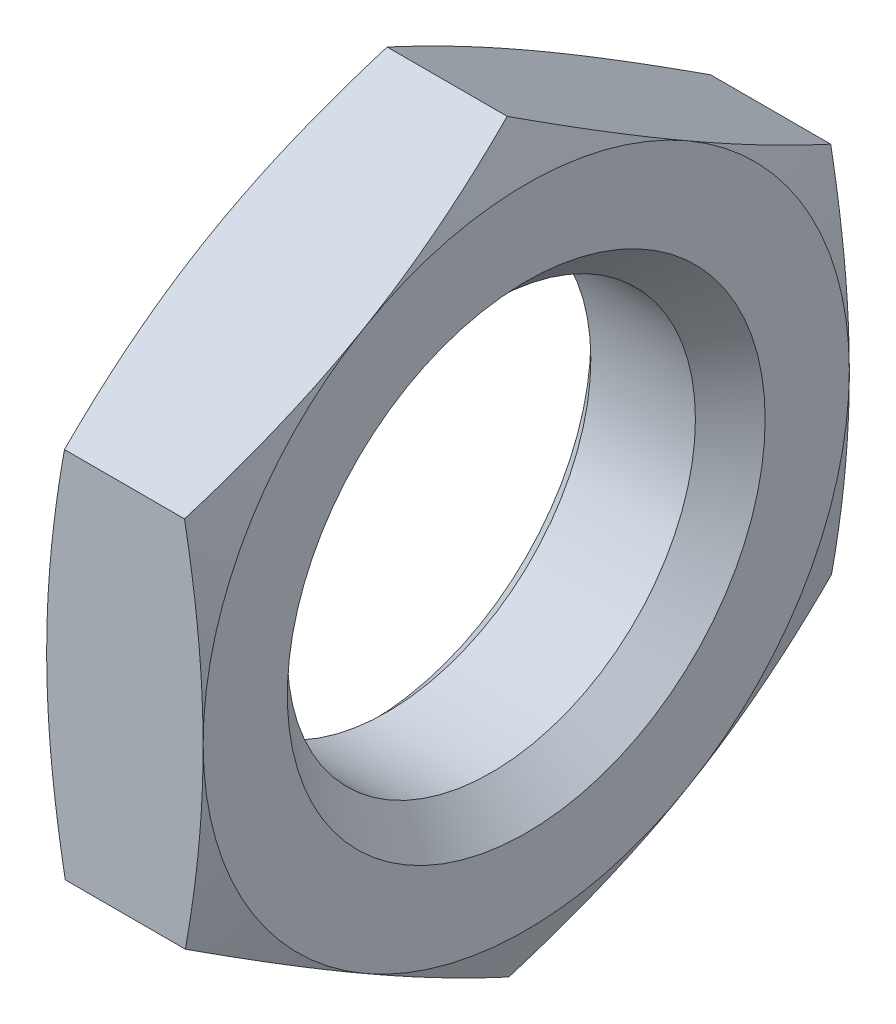
ISO-10303-21;
HEADER;
FILE_DESCRIPTION(('STEP AP214'),'2;1');
FILE_NAME('part.step','',(''),(''),'','','');
FILE_SCHEMA(('AUTOMOTIVE_DESIGN { 1 0 10303 214 1 1 1 1 }'));
ENDSEC;
DATA;
#1=APPLICATION_CONTEXT('core data for automotive mechanical design processes');
#2=APPLICATION_PROTOCOL_DEFINITION('international standard','automotive_design',2000,#1);
#3=PRODUCT_CONTEXT('',#1,'mechanical');
#4=PRODUCT('Part','Part','',(#3));
#5=PRODUCT_RELATED_PRODUCT_CATEGORY('part','',(#4));
#6=PRODUCT_DEFINITION_FORMATION('','',#4);
#7=PRODUCT_DEFINITION_CONTEXT('part definition',#1,'design');
#8=PRODUCT_DEFINITION('design','',#6,#7);
#9=PRODUCT_DEFINITION_SHAPE('','',#8);
#10=(LENGTH_UNIT() NAMED_UNIT(*) SI_UNIT(.MILLI.,.METRE.));
#11=(NAMED_UNIT(*) PLANE_ANGLE_UNIT() SI_UNIT($,.RADIAN.));
#12=(NAMED_UNIT(*) SI_UNIT($,.STERADIAN.) SOLID_ANGLE_UNIT());
#13=UNCERTAINTY_MEASURE_WITH_UNIT(LENGTH_MEASURE(1.E-05),#10,'distance_accuracy_value','');
#14=(GEOMETRIC_REPRESENTATION_CONTEXT(3) GLOBAL_UNCERTAINTY_ASSIGNED_CONTEXT((#13)) GLOBAL_UNIT_ASSIGNED_CONTEXT((#10,
#11,#12)) REPRESENTATION_CONTEXT('',''));
#15=CARTESIAN_POINT('',(0.,0.,0.));
#16=DIRECTION('',(0.,0.,1.));
#17=DIRECTION('',(1.,0.,0.));
#18=AXIS2_PLACEMENT_3D('',#15,#16,#17);
#19=CARTESIAN_POINT('',(4.59999999999999,-5.46387461975121,-9.51206641445337));
#20=DIRECTION('',(0.,-0.00220416988287132,0.999997570814613));
#21=DIRECTION('',(0.,-0.999997570814613,-0.00220416988287132));
#22=AXIS2_PLACEMENT_3D('',#19,#20,#21);
#23=PLANE('',#22);
#24=CARTESIAN_POINT('',(4.06505288603794,-5.46407461975121,-9.51206685528842));
#25=CARTESIAN_POINT('',(4.14775708448037,-5.00978168241182,-9.51106551404549));
#26=CARTESIAN_POINT('',(4.22299075546714,-4.55399071947763,-9.51006087089164));
#27=CARTESIAN_POINT('',(4.35535262343732,-3.63944530321819,-9.50804505253181));
#28=CARTESIAN_POINT('',(4.41246665386016,-3.18068881585676,-9.50703387284245));
#29=CARTESIAN_POINT('',(4.50484691282821,-2.26530330051834,-9.50501620275703));
#30=CARTESIAN_POINT('',(4.54031462955601,-1.80869517614271,-9.50400975843617));
#31=CARTESIAN_POINT('',(4.58788679321137,-0.894411186660822,-9.50199451630677));
#32=CARTESIAN_POINT('',(4.59999999999999,-0.436735786386771,-9.5009857195228));
#33=CARTESIAN_POINT('',(4.59999999999999,0.478615014161329,-9.49896812595486));
#34=CARTESIAN_POINT('',(4.58788679321137,0.936290414435379,-9.49795932917089));
#35=CARTESIAN_POINT('',(4.54031462955601,1.85057440391726,-9.49594408704148));
#36=CARTESIAN_POINT('',(4.50484691282821,2.30718252829289,-9.49493764272062));
#37=CARTESIAN_POINT('',(4.41246665386016,3.22256804363132,-9.4929199726352));
#38=CARTESIAN_POINT('',(4.35535262343732,3.68132453099275,-9.49190879294584));
#39=CARTESIAN_POINT('',(4.22299075546714,4.59586994725219,-9.48989297458601));
#40=CARTESIAN_POINT('',(4.14775708448037,5.05166091018637,-9.48888833143216));
#41=CARTESIAN_POINT('',(4.06505288603794,5.50595384752577,-9.48788699018923));
#42=B_SPLINE_CURVE_WITH_KNOTS('',3,(#24,#25,#26,#27,#28,#29,#30,#31,#32,#33,#34,#35,#36,#37,#38,
#39,#40,#41),.UNSPECIFIED.,.F.,.F.,(4,2,2,2,2,2,2,2,4),(0.,1.38542535879321,2.77193123674513,
4.14532616339404,5.51820585375358,6.89108554411312,8.26448047076202,9.65098634871394,
11.0364117075072),.UNSPECIFIED.);
#43=CARTESIAN_POINT('',(4.06508928364747,-5.46387461975121,-9.51206641445337));
#44=VERTEX_POINT('',#43);
#45=CARTESIAN_POINT('',(4.59999999999999,0.0209396138872772,-9.49997692273882));
#46=VERTEX_POINT('',#45);
#47=EDGE_CURVE('E371',#44,#46,#42,.T.);
#48=ORIENTED_EDGE('',*,*,#47,.F.);
#49=DIRECTION('',(-1.,0.,0.));
#50=VECTOR('',#49,1.);
#51=CARTESIAN_POINT('',(4.59999999999999,-5.46387461975121,-9.51206641445337));
#52=LINE('',#51,#50);
#53=CARTESIAN_POINT('',(0.534910716352532,-5.46387461975121,-9.51206641445337));
#54=VERTEX_POINT('',#53);
#55=EDGE_CURVE('E270',#44,#54,#52,.T.);
#56=ORIENTED_EDGE('',*,*,#55,.T.);
#57=CARTESIAN_POINT('',(0.53494711396207,5.50595384752577,-9.48788699018923));
#58=CARTESIAN_POINT('',(0.452242915519633,5.05166091018637,-9.48888833143216));
#59=CARTESIAN_POINT('',(0.377009244532853,4.59586994725219,-9.48989297458601));
#60=CARTESIAN_POINT('',(0.244647376562674,3.68132453099275,-9.49190879294584));
#61=CARTESIAN_POINT('',(0.187533346139829,3.22256804363132,-9.4929199726352));
#62=CARTESIAN_POINT('',(0.0951530871717847,2.30718252829289,-9.49493764272062));
#63=CARTESIAN_POINT('',(0.0596853704439779,1.85057440391726,-9.49594408704148));
#64=CARTESIAN_POINT('',(0.0121132067886231,0.936290414435379,-9.49795932917089));
#65=CARTESIAN_POINT('',(0.,0.478615014161329,-9.49896812595486));
#66=CARTESIAN_POINT('',(0.,-0.436735786386771,-9.5009857195228));
#67=CARTESIAN_POINT('',(0.0121132067886229,-0.894411186660821,-9.50199451630677));
#68=CARTESIAN_POINT('',(0.0596853704439779,-1.80869517614271,-9.50400975843617));
#69=CARTESIAN_POINT('',(0.0951530871717849,-2.26530330051833,-9.50501620275703));
#70=CARTESIAN_POINT('',(0.187533346139829,-3.18068881585676,-9.50703387284245));
#71=CARTESIAN_POINT('',(0.244647376562674,-3.6394453032182,-9.50804505253181));
#72=CARTESIAN_POINT('',(0.377009244532853,-4.55399071947763,-9.51006087089164));
#73=CARTESIAN_POINT('',(0.452242915519632,-5.00978168241182,-9.51106551404549));
#74=CARTESIAN_POINT('',(0.53494711396207,-5.46407461975121,-9.51206685528842));
#75=B_SPLINE_CURVE_WITH_KNOTS('',3,(#57,#58,#59,#60,#61,#62,#63,#64,#65,#66,#67,#68,#69,#70,#71,
#72,#73,#74),.UNSPECIFIED.,.F.,.F.,(4,2,2,2,2,2,2,2,4),(0.,1.38542535879322,2.77193123674514,
4.14532616339404,5.51820585375358,6.89108554411312,8.26448047076202,9.65098634871394,
11.0364117075072),.UNSPECIFIED.);
#76=CARTESIAN_POINT('',(0.,0.0209396138872772,-9.49997692273882));
#77=VERTEX_POINT('',#76);
#78=EDGE_CURVE('E243',#77,#54,#75,.T.);
#79=ORIENTED_EDGE('',*,*,#78,.F.);
#80=CARTESIAN_POINT('',(0.534910716352532,5.50575384752577,-9.48788743102428));
#81=VERTEX_POINT('',#80);
#82=EDGE_CURVE('E324',#81,#77,#75,.T.);
#83=ORIENTED_EDGE('',*,*,#82,.F.);
#84=DIRECTION('',(-1.,0.,0.));
#85=VECTOR('',#84,1.);
#86=CARTESIAN_POINT('',(4.59999999999999,5.50575384752577,-9.48788743102428));
#87=LINE('',#86,#85);
#88=CARTESIAN_POINT('',(4.06508928364747,5.50575384752577,-9.48788743102428));
#89=VERTEX_POINT('',#88);
#90=EDGE_CURVE('E279',#89,#81,#87,.T.);
#91=ORIENTED_EDGE('',*,*,#90,.F.);
#92=EDGE_CURVE('E146',#46,#89,#42,.T.);
#93=ORIENTED_EDGE('',*,*,#92,.F.);
#94=EDGE_LOOP('',(#48,#56,#79,#83,#91,#93));
#95=FACE_BOUND('',#94,.T.);
#96=ADVANCED_FACE('F52',(#95),#23,.F.);
#97=CARTESIAN_POINT('',(4.59999999999999,5.50575384752577,-9.48788743102428));
#98=DIRECTION('',(0.,-0.867125384989619,0.498089918294484));
#99=DIRECTION('',(0.,-0.498089918294484,-0.867125384989619));
#100=AXIS2_PLACEMENT_3D('',#97,#98,#99);
#101=PLANE('',#100);
#102=CARTESIAN_POINT('',(4.06504730863669,5.50563896450495,-9.48808743102428));
#103=CARTESIAN_POINT('',(4.14775231079011,5.73191950073375,-9.09415535192314));
#104=CARTESIAN_POINT('',(4.22298673902135,5.95894619869942,-8.69892427888622));
#105=CARTESIAN_POINT('',(4.3553499712917,6.41447570420105,-7.90589237174632));
#106=CARTESIAN_POINT('',(4.41246460837906,6.64297952490508,-7.50808977381775));
#107=CARTESIAN_POINT('',(4.50484586014554,7.09892748141666,-6.71432938477171));
#108=CARTESIAN_POINT('',(4.5403139669336,7.32636120506701,-6.31838972019225));
#109=CARTESIAN_POINT('',(4.58788665679706,7.7817604926368,-5.52558450961883));
#110=CARTESIAN_POINT('',(4.59999999999999,8.00972582501909,-5.12871936670821));
#111=CARTESIAN_POINT('',(4.59999999999999,8.46565648978367,-4.33498908088698));
#112=CARTESIAN_POINT('',(4.58788665679706,8.69362182216596,-3.93812393797636));
#113=CARTESIAN_POINT('',(4.5403139669336,9.14902110973575,-3.14531872740294));
#114=CARTESIAN_POINT('',(4.50484586014554,9.37645483338609,-2.74937906282348));
#115=CARTESIAN_POINT('',(4.41246460837906,9.83240278989768,-1.95561867377744));
#116=CARTESIAN_POINT('',(4.3553499712917,10.0609066106017,-1.55781607584887));
#117=CARTESIAN_POINT('',(4.22298673902135,10.5164361161033,-0.764784168708969));
#118=CARTESIAN_POINT('',(4.1477523107901,10.743462814069,-0.369553095672043));
#119=CARTESIAN_POINT('',(4.06504730863669,10.9697433502978,0.0243789834290936));
#120=B_SPLINE_CURVE_WITH_KNOTS('',3,(#102,#103,#104,#105,#106,#107,#108,#109,#110,#111,#112,
#113,#114,#115,#116,#117,#118,#119),.UNSPECIFIED.,.F.,.F.,(4,2,2,2,2,2,2,2,4),(0.,
1.3854332282636,2.77194700262361,4.14534962448271,5.51823699708701,6.8911243696913,
8.2645269915504,9.65104076591042,11.036473994174),.UNSPECIFIED.);
#121=CARTESIAN_POINT('',(4.59999999999999,8.23769115740138,-4.73185422379759));
#122=VERTEX_POINT('',#121);
#123=EDGE_CURVE('E142',#89,#122,#120,.T.);
#124=ORIENTED_EDGE('',*,*,#123,.F.);
#125=ORIENTED_EDGE('',*,*,#90,.T.);
#126=CARTESIAN_POINT('',(0.534952691363305,10.9697433502978,0.0243789834290936));
#127=CARTESIAN_POINT('',(0.452247689209888,10.743462814069,-0.369553095672043));
#128=CARTESIAN_POINT('',(0.377013260978639,10.5164361161033,-0.764784168708969));
#129=CARTESIAN_POINT('',(0.244650028708293,10.0609066106017,-1.55781607584887));
#130=CARTESIAN_POINT('',(0.187535391620937,9.83240278989768,-1.95561867377744));
#131=CARTESIAN_POINT('',(0.0951541398544488,9.37645483338609,-2.74937906282348));
#132=CARTESIAN_POINT('',(0.0596860330663905,9.14902110973575,-3.14531872740294));
#133=CARTESIAN_POINT('',(0.0121133432029318,8.69362182216596,-3.93812393797636));
#134=CARTESIAN_POINT('',(0.,8.46565648978367,-4.33498908088698));
#135=CARTESIAN_POINT('',(0.,8.00972582501909,-5.12871936670821));
#136=CARTESIAN_POINT('',(0.0121133432029316,7.7817604926368,-5.52558450961883));
#137=CARTESIAN_POINT('',(0.0596860330663904,7.32636120506701,-6.31838972019225));
#138=CARTESIAN_POINT('',(0.0951541398544488,7.09892748141666,-6.71432938477171));
#139=CARTESIAN_POINT('',(0.187535391620936,6.64297952490508,-7.50808977381775));
#140=CARTESIAN_POINT('',(0.244650028708292,6.41447570420105,-7.90589237174632));
#141=CARTESIAN_POINT('',(0.377013260978638,5.95894619869942,-8.69892427888622));
#142=CARTESIAN_POINT('',(0.452247689209887,5.73191950073375,-9.09415535192314));
#143=CARTESIAN_POINT('',(0.534952691363305,5.50563896450495,-9.48808743102428));
#144=B_SPLINE_CURVE_WITH_KNOTS('',3,(#126,#127,#128,#129,#130,#131,#132,#133,#134,#135,#136,
#137,#138,#139,#140,#141,#142,#143),.UNSPECIFIED.,.F.,.F.,(4,2,2,2,2,2,2,2,4),(0.,
1.38543322826359,2.77194700262361,4.14534962448271,5.518236997087,6.8911243696913,
8.2645269915504,9.65104076591041,11.036473994174),.UNSPECIFIED.);
#145=CARTESIAN_POINT('',(0.,8.23769115740138,-4.73185422379759));
#146=VERTEX_POINT('',#145);
#147=EDGE_CURVE('E240',#146,#81,#144,.T.);
#148=ORIENTED_EDGE('',*,*,#147,.F.);
#149=CARTESIAN_POINT('',(0.534910716352532,10.969628467277,0.0241789834290879));
#150=VERTEX_POINT('',#149);
#151=EDGE_CURVE('E255',#150,#146,#144,.T.);
#152=ORIENTED_EDGE('',*,*,#151,.F.);
#153=DIRECTION('',(-1.,0.,0.));
#154=VECTOR('',#153,1.);
#155=CARTESIAN_POINT('',(4.59999999999999,10.969628467277,0.0241789834290879));
#156=LINE('',#155,#154);
#157=CARTESIAN_POINT('',(4.06508928364747,10.969628467277,0.0241789834290879));
#158=VERTEX_POINT('',#157);
#159=EDGE_CURVE('E165',#158,#150,#156,.T.);
#160=ORIENTED_EDGE('',*,*,#159,.F.);
#161=EDGE_CURVE('E150',#122,#158,#120,.T.);
#162=ORIENTED_EDGE('',*,*,#161,.F.);
#163=EDGE_LOOP('',(#124,#125,#148,#152,#160,#162));
#164=FACE_BOUND('',#163,.T.);
#165=ADVANCED_FACE('F163',(#164),#101,.F.);
#166=CARTESIAN_POINT('',(4.59999999999999,10.969628467277,0.0241789834290879));
#167=DIRECTION('',(0.,-0.864921215106748,-0.50190765252013));
#168=DIRECTION('',(0.,0.50190765252013,-0.864921215106748));
#169=AXIS2_PLACEMENT_3D('',#166,#167,#168);
#170=PLANE('',#169);
#171=CARTESIAN_POINT('',(4.06504720166566,10.9697445258598,0.023978983429096));
#172=CARTESIAN_POINT('',(4.14775221923373,10.7417295818619,0.416909757516641));
#173=CARTESIAN_POINT('',(4.22298666198845,10.5129627568208,0.811136223873899));
#174=CARTESIAN_POINT('',(4.35534992042521,10.0539416827472,1.6021523862174));
#175=CARTESIAN_POINT('',(4.41246456914801,9.8236864127804,1.9989438415468));
#176=CARTESIAN_POINT('',(4.50484583995575,9.36424368027611,2.79068663421848));
#177=CARTESIAN_POINT('',(4.54031395422492,9.13506670970743,3.18561989109046));
#178=CARTESIAN_POINT('',(4.58788665418072,8.67617685172253,3.97640993299472));
#179=CARTESIAN_POINT('',(4.59999999999999,8.44646419761831,4.37226631596798));
#180=CARTESIAN_POINT('',(4.59999999999999,7.98703888940988,5.16397908191448));
#181=CARTESIAN_POINT('',(4.58788665418072,7.75732623530566,5.55983546488774));
#182=CARTESIAN_POINT('',(4.54031395422492,7.29843637732077,6.35062550679199));
#183=CARTESIAN_POINT('',(4.50484583995575,7.06925940675208,6.74555876366398));
#184=CARTESIAN_POINT('',(4.41246456914801,6.60981667424779,7.53730155633566));
#185=CARTESIAN_POINT('',(4.35534992042521,6.37956140428098,7.93409301166506));
#186=CARTESIAN_POINT('',(4.22298666198845,5.92054033020742,8.72510917400856));
#187=CARTESIAN_POINT('',(4.14775221923373,5.6917735051663,9.11933564036582));
#188=CARTESIAN_POINT('',(4.06504720166566,5.46375856116836,9.51226641445337));
#189=B_SPLINE_CURVE_WITH_KNOTS('',3,(#171,#172,#173,#174,#175,#176,#177,#178,#179,#180,#181,
#182,#183,#184,#185,#186,#187,#188),.UNSPECIFIED.,.F.,.F.,(4,2,2,2,2,2,2,2,4),(0.,
1.38543337919476,2.77194730500259,4.14535007445066,5.51823759439524,6.89112511433982,
8.26452788378788,9.65104180959572,11.0364751887905),.UNSPECIFIED.);
#190=CARTESIAN_POINT('',(4.59999999999999,8.2167515435141,4.76812269894124));
#191=VERTEX_POINT('',#190);
#192=EDGE_CURVE('E155',#158,#191,#189,.T.);
#193=ORIENTED_EDGE('',*,*,#192,.F.);
#194=ORIENTED_EDGE('',*,*,#159,.T.);
#195=CARTESIAN_POINT('',(0.534952798334348,5.46375856116836,9.51226641445337));
#196=CARTESIAN_POINT('',(0.452247780766266,5.6917735051663,9.11933564036582));
#197=CARTESIAN_POINT('',(0.377013338011548,5.92054033020742,8.72510917400856));
#198=CARTESIAN_POINT('',(0.244650079574786,6.37956140428098,7.93409301166506));
#199=CARTESIAN_POINT('',(0.187535430851987,6.60981667424779,7.53730155633566));
#200=CARTESIAN_POINT('',(0.095154160044247,7.06925940675208,6.74555876366398));
#201=CARTESIAN_POINT('',(0.0596860457750757,7.29843637732076,6.35062550679199));
#202=CARTESIAN_POINT('',(0.012113345819272,7.75732623530566,5.55983546488774));
#203=CARTESIAN_POINT('',(0.,7.98703888940988,5.16397908191448));
#204=CARTESIAN_POINT('',(0.,8.44646419761831,4.37226631596798));
#205=CARTESIAN_POINT('',(0.0121133458192715,8.67617685172253,3.97640993299472));
#206=CARTESIAN_POINT('',(0.0596860457750754,9.13506670970743,3.18561989109046));
#207=CARTESIAN_POINT('',(0.0951541600442474,9.36424368027611,2.79068663421848));
#208=CARTESIAN_POINT('',(0.187535430851987,9.8236864127804,1.9989438415468));
#209=CARTESIAN_POINT('',(0.244650079574786,10.0539416827472,1.6021523862174));
#210=CARTESIAN_POINT('',(0.377013338011547,10.5129627568208,0.811136223873898));
#211=CARTESIAN_POINT('',(0.452247780766265,10.7417295818619,0.41690975751664));
#212=CARTESIAN_POINT('',(0.534952798334348,10.9697445258598,0.023978983429096));
#213=B_SPLINE_CURVE_WITH_KNOTS('',3,(#195,#196,#197,#198,#199,#200,#201,#202,#203,#204,#205,
#206,#207,#208,#209,#210,#211,#212),.UNSPECIFIED.,.F.,.F.,(4,2,2,2,2,2,2,2,4),(0.,
1.38543337919476,2.7719473050026,4.14535007445066,5.51823759439524,6.89112511433983,
8.26452788378789,9.65104180959572,11.0364751887905),.UNSPECIFIED.);
#214=CARTESIAN_POINT('',(0.,8.2167515435141,4.76812269894124));
#215=VERTEX_POINT('',#214);
#216=EDGE_CURVE('E256',#215,#150,#213,.T.);
#217=ORIENTED_EDGE('',*,*,#216,.F.);
#218=CARTESIAN_POINT('',(0.534910716352532,5.46387461975121,9.51206641445337));
#219=VERTEX_POINT('',#218);
#220=EDGE_CURVE('E263',#219,#215,#213,.T.);
#221=ORIENTED_EDGE('',*,*,#220,.F.);
#222=DIRECTION('',(-1.,0.,0.));
#223=VECTOR('',#222,1.);
#224=CARTESIAN_POINT('',(4.59999999999999,5.46387461975121,9.51206641445337));
#225=LINE('',#224,#223);
#226=CARTESIAN_POINT('',(4.06508928364747,5.46387461975121,9.51206641445337));
#227=VERTEX_POINT('',#226);
#228=EDGE_CURVE('E276',#227,#219,#225,.T.);
#229=ORIENTED_EDGE('',*,*,#228,.F.);
#230=EDGE_CURVE('E166',#191,#227,#189,.T.);
#231=ORIENTED_EDGE('',*,*,#230,.F.);
#232=EDGE_LOOP('',(#193,#194,#217,#221,#229,#231));
#233=FACE_BOUND('',#232,.T.);
#234=ADVANCED_FACE('F227',(#233),#170,.F.);
#235=CARTESIAN_POINT('',(4.59999999999999,5.46387461975121,9.51206641445337));
#236=DIRECTION('',(0.,0.00220416988287148,-0.999997570814613));
#237=DIRECTION('',(0.,0.999997570814613,0.00220416988287148));
#238=AXIS2_PLACEMENT_3D('',#235,#236,#237);
#239=PLANE('',#238);
#240=CARTESIAN_POINT('',(4.06505288603794,5.46407461975121,9.51206685528841));
#241=CARTESIAN_POINT('',(4.14775708448037,5.00978168241182,9.51106551404549));
#242=CARTESIAN_POINT('',(4.22299075546714,4.55399071947763,9.51006087089164));
#243=CARTESIAN_POINT('',(4.35535262343732,3.63944530321819,9.50804505253181));
#244=CARTESIAN_POINT('',(4.41246665386016,3.18068881585676,9.50703387284245));
#245=CARTESIAN_POINT('',(4.50484691282821,2.26530330051833,9.50501620275703));
#246=CARTESIAN_POINT('',(4.54031462955602,1.80869517614271,9.50400975843617));
#247=CARTESIAN_POINT('',(4.58788679321137,0.894411186660819,9.50199451630677));
#248=CARTESIAN_POINT('',(4.59999999999999,0.436735786386769,9.5009857195228));
#249=CARTESIAN_POINT('',(4.59999999999999,-0.478615014161332,9.49896812595486));
#250=CARTESIAN_POINT('',(4.58788679321137,-0.936290414435382,9.49795932917089));
#251=CARTESIAN_POINT('',(4.54031462955602,-1.85057440391727,9.49594408704148));
#252=CARTESIAN_POINT('',(4.50484691282821,-2.3071825282929,9.49493764272062));
#253=CARTESIAN_POINT('',(4.41246665386016,-3.22256804363132,9.4929199726352));
#254=CARTESIAN_POINT('',(4.35535262343732,-3.68132453099276,9.49190879294584));
#255=CARTESIAN_POINT('',(4.22299075546714,-4.59586994725219,9.48989297458601));
#256=CARTESIAN_POINT('',(4.14775708448037,-5.05166091018638,9.48888833143216));
#257=CARTESIAN_POINT('',(4.06505288603794,-5.50595384752577,9.48788699018922));
#258=B_SPLINE_CURVE_WITH_KNOTS('',3,(#240,#241,#242,#243,#244,#245,#246,#247,#248,#249,#250,
#251,#252,#253,#254,#255,#256,#257),.UNSPECIFIED.,.F.,.F.,(4,2,2,2,2,2,2,2,4),(0.,
1.38542535879321,2.77193123674513,4.14532616339404,5.51820585375358,6.89108554411312,
8.26448047076203,9.65098634871395,11.0364117075072),.UNSPECIFIED.);
#259=CARTESIAN_POINT('',(4.59999999999999,-0.0209396138872789,9.49997692273882));
#260=VERTEX_POINT('',#259);
#261=EDGE_CURVE('E221',#227,#260,#258,.T.);
#262=ORIENTED_EDGE('',*,*,#261,.F.);
#263=ORIENTED_EDGE('',*,*,#228,.T.);
#264=CARTESIAN_POINT('',(0.53494711396207,-5.50595384752577,9.48788699018922));
#265=CARTESIAN_POINT('',(0.452242915519632,-5.05166091018638,9.48888833143216));
#266=CARTESIAN_POINT('',(0.377009244532853,-4.5958699472522,9.48989297458601));
#267=CARTESIAN_POINT('',(0.244647376562674,-3.68132453099276,9.49190879294584));
#268=CARTESIAN_POINT('',(0.18753334613983,-3.22256804363132,9.4929199726352));
#269=CARTESIAN_POINT('',(0.0951530871717848,-2.3071825282929,9.49493764272062));
#270=CARTESIAN_POINT('',(0.0596853704439775,-1.85057440391727,9.49594408704148));
#271=CARTESIAN_POINT('',(0.0121132067886228,-0.936290414435381,9.49795932917089));
#272=CARTESIAN_POINT('',(0.,-0.478615014161331,9.49896812595486));
#273=CARTESIAN_POINT('',(0.,0.436735786386769,9.5009857195228));
#274=CARTESIAN_POINT('',(0.012113206788623,0.89441118666082,9.50199451630677));
#275=CARTESIAN_POINT('',(0.0596853704439774,1.80869517614271,9.50400975843617));
#276=CARTESIAN_POINT('',(0.0951530871717841,2.26530330051833,9.50501620275703));
#277=CARTESIAN_POINT('',(0.187533346139829,3.18068881585676,9.50703387284245));
#278=CARTESIAN_POINT('',(0.244647376562674,3.63944530321819,9.50804505253181));
#279=CARTESIAN_POINT('',(0.377009244532853,4.55399071947763,9.51006087089164));
#280=CARTESIAN_POINT('',(0.452242915519633,5.00978168241182,9.51106551404549));
#281=CARTESIAN_POINT('',(0.53494711396207,5.46407461975121,9.51206685528841));
#282=B_SPLINE_CURVE_WITH_KNOTS('',3,(#264,#265,#266,#267,#268,#269,#270,#271,#272,#273,#274,
#275,#276,#277,#278,#279,#280,#281),.UNSPECIFIED.,.F.,.F.,(4,2,2,2,2,2,2,2,4),(0.,
1.38542535879321,2.77193123674514,4.14532616339404,5.51820585375358,6.89108554411312,
8.26448047076203,9.65098634871395,11.0364117075072),.UNSPECIFIED.);
#283=CARTESIAN_POINT('',(0.,-0.0209396138872789,9.49997692273882));
#284=VERTEX_POINT('',#283);
#285=EDGE_CURVE('E242',#284,#219,#282,.T.);
#286=ORIENTED_EDGE('',*,*,#285,.F.);
#287=CARTESIAN_POINT('',(0.534910716352532,-5.50575384752577,9.48788743102427));
#288=VERTEX_POINT('',#287);
#289=EDGE_CURVE('E233',#288,#284,#282,.T.);
#290=ORIENTED_EDGE('',*,*,#289,.F.);
#291=DIRECTION('',(-1.,0.,0.));
#292=VECTOR('',#291,1.);
#293=CARTESIAN_POINT('',(4.59999999999999,-5.50575384752577,9.48788743102427));
#294=LINE('',#293,#292);
#295=CARTESIAN_POINT('',(4.06508928364747,-5.50575384752577,9.48788743102427));
#296=VERTEX_POINT('',#295);
#297=EDGE_CURVE('E274',#296,#288,#294,.T.);
#298=ORIENTED_EDGE('',*,*,#297,.F.);
#299=EDGE_CURVE('E215',#260,#296,#258,.T.);
#300=ORIENTED_EDGE('',*,*,#299,.F.);
#301=EDGE_LOOP('',(#262,#263,#286,#290,#298,#300));
#302=FACE_BOUND('',#301,.T.);
#303=ADVANCED_FACE('F223',(#302),#239,.F.);
#304=CARTESIAN_POINT('',(4.59999999999999,-5.50575384752577,9.48788743102427));
#305=DIRECTION('',(0.,0.867125384989619,-0.498089918294484));
#306=DIRECTION('',(0.,0.498089918294484,0.867125384989619));
#307=AXIS2_PLACEMENT_3D('',#304,#305,#306);
#308=PLANE('',#307);
#309=CARTESIAN_POINT('',(4.06504730863669,-5.50563896450495,9.48808743102428));
#310=CARTESIAN_POINT('',(4.1477523107901,-5.73191950073376,9.09415535192314));
#311=CARTESIAN_POINT('',(4.22298673902135,-5.95894619869943,8.69892427888622));
#312=CARTESIAN_POINT('',(4.3553499712917,-6.41447570420106,7.90589237174631));
#313=CARTESIAN_POINT('',(4.41246460837906,-6.64297952490508,7.50808977381775));
#314=CARTESIAN_POINT('',(4.50484586014554,-7.09892748141666,6.7143293847717));
#315=CARTESIAN_POINT('',(4.5403139669336,-7.32636120506701,6.31838972019225));
#316=CARTESIAN_POINT('',(4.58788665679706,-7.78176049263681,5.52558450961882));
#317=CARTESIAN_POINT('',(4.59999999999999,-8.00972582501909,5.12871936670821));
#318=CARTESIAN_POINT('',(4.59999999999999,-8.46565648978367,4.33498908088698));
#319=CARTESIAN_POINT('',(4.58788665679706,-8.69362182216596,3.93812393797636));
#320=CARTESIAN_POINT('',(4.5403139669336,-9.14902110973575,3.14531872740293));
#321=CARTESIAN_POINT('',(4.50484586014554,-9.37645483338609,2.74937906282348));
#322=CARTESIAN_POINT('',(4.41246460837906,-9.83240278989768,1.95561867377744));
#323=CARTESIAN_POINT('',(4.3553499712917,-10.0609066106017,1.55781607584887));
#324=CARTESIAN_POINT('',(4.22298673902135,-10.5164361161033,0.764784168708968));
#325=CARTESIAN_POINT('',(4.1477523107901,-10.743462814069,0.369553095672043));
#326=CARTESIAN_POINT('',(4.06504730863669,-10.9697433502978,-0.0243789834290936));
#327=B_SPLINE_CURVE_WITH_KNOTS('',3,(#309,#310,#311,#312,#313,#314,#315,#316,#317,#318,#319,
#320,#321,#322,#323,#324,#325,#326),.UNSPECIFIED.,.F.,.F.,(4,2,2,2,2,2,2,2,4),(0.,
1.3854332282636,2.77194700262361,4.14534962448271,5.51823699708701,6.8911243696913,
8.2645269915504,9.65104076591041,11.036473994174),.UNSPECIFIED.);
#328=CARTESIAN_POINT('',(4.59999999999999,-8.23769115740138,4.7318542237976));
#329=VERTEX_POINT('',#328);
#330=EDGE_CURVE('E222',#296,#329,#327,.T.);
#331=ORIENTED_EDGE('',*,*,#330,.F.);
#332=ORIENTED_EDGE('',*,*,#297,.T.);
#333=CARTESIAN_POINT('',(0.534952691363305,-10.9697433502978,-0.0243789834290936));
#334=CARTESIAN_POINT('',(0.452247689209889,-10.743462814069,0.369553095672042));
#335=CARTESIAN_POINT('',(0.377013260978639,-10.5164361161033,0.764784168708968));
#336=CARTESIAN_POINT('',(0.244650028708292,-10.0609066106017,1.55781607584887));
#337=CARTESIAN_POINT('',(0.187535391620936,-9.83240278989768,1.95561867377744));
#338=CARTESIAN_POINT('',(0.0951541398544488,-9.37645483338609,2.74937906282348));
#339=CARTESIAN_POINT('',(0.0596860330663911,-9.14902110973575,3.14531872740293));
#340=CARTESIAN_POINT('',(0.0121133432029321,-8.69362182216596,3.93812393797636));
#341=CARTESIAN_POINT('',(0.,-8.46565648978367,4.33498908088698));
#342=CARTESIAN_POINT('',(0.,-8.00972582501909,5.12871936670821));
#343=CARTESIAN_POINT('',(0.0121133432029317,-7.78176049263681,5.52558450961882));
#344=CARTESIAN_POINT('',(0.0596860330663905,-7.32636120506701,6.31838972019225));
#345=CARTESIAN_POINT('',(0.0951541398544481,-7.09892748141667,6.7143293847717));
#346=CARTESIAN_POINT('',(0.187535391620936,-6.64297952490508,7.50808977381775));
#347=CARTESIAN_POINT('',(0.244650028708292,-6.41447570420106,7.90589237174631));
#348=CARTESIAN_POINT('',(0.377013260978638,-5.95894619869943,8.69892427888622));
#349=CARTESIAN_POINT('',(0.452247689209888,-5.73191950073376,9.09415535192314));
#350=CARTESIAN_POINT('',(0.534952691363305,-5.50563896450495,9.48808743102428));
#351=B_SPLINE_CURVE_WITH_KNOTS('',3,(#333,#334,#335,#336,#337,#338,#339,#340,#341,#342,#343,
#344,#345,#346,#347,#348,#349,#350),.UNSPECIFIED.,.F.,.F.,(4,2,2,2,2,2,2,2,4),(0.,
1.3854332282636,2.77194700262361,4.14534962448271,5.518236997087,6.8911243696913,
8.2645269915504,9.65104076591041,11.036473994174),.UNSPECIFIED.);
#352=CARTESIAN_POINT('',(0.,-8.23769115740138,4.7318542237976));
#353=VERTEX_POINT('',#352);
#354=EDGE_CURVE('E241',#353,#288,#351,.T.);
#355=ORIENTED_EDGE('',*,*,#354,.F.);
#356=CARTESIAN_POINT('',(0.534910716352532,-10.969628467277,-0.0241789834290879));
#357=VERTEX_POINT('',#356);
#358=EDGE_CURVE('E322',#357,#353,#351,.T.);
#359=ORIENTED_EDGE('',*,*,#358,.F.);
#360=DIRECTION('',(-1.,0.,0.));
#361=VECTOR('',#360,1.);
#362=CARTESIAN_POINT('',(4.59999999999999,-10.969628467277,-0.0241789834290879));
#363=LINE('',#362,#361);
#364=CARTESIAN_POINT('',(4.06508928364747,-10.969628467277,-0.0241789834290879));
#365=VERTEX_POINT('',#364);
#366=EDGE_CURVE('E272',#365,#357,#363,.T.);
#367=ORIENTED_EDGE('',*,*,#366,.F.);
#368=EDGE_CURVE('E209',#329,#365,#327,.T.);
#369=ORIENTED_EDGE('',*,*,#368,.F.);
#370=EDGE_LOOP('',(#331,#332,#355,#359,#367,#369));
#371=FACE_BOUND('',#370,.T.);
#372=ADVANCED_FACE('F226',(#371),#308,.F.);
#373=CARTESIAN_POINT('',(4.59999999999999,-10.969628467277,-0.0241789834290879));
#374=DIRECTION('',(0.,0.864921215106747,0.50190765252013));
#375=DIRECTION('',(0.,-0.50190765252013,0.864921215106747));
#376=AXIS2_PLACEMENT_3D('',#373,#374,#375);
#377=PLANE('',#376);
#378=CARTESIAN_POINT('',(4.06504720166566,-10.9697445258598,-0.023978983429096));
#379=CARTESIAN_POINT('',(4.14775221923373,-10.7417295818619,-0.41690975751664));
#380=CARTESIAN_POINT('',(4.22298666198845,-10.5129627568208,-0.811136223873899));
#381=CARTESIAN_POINT('',(4.3553499204252,-10.0539416827472,-1.6021523862174));
#382=CARTESIAN_POINT('',(4.412464569148,-9.8236864127804,-1.9989438415468));
#383=CARTESIAN_POINT('',(4.50484583995575,-9.36424368027611,-2.79068663421848));
#384=CARTESIAN_POINT('',(4.54031395422492,-9.13506670970743,-3.18561989109047));
#385=CARTESIAN_POINT('',(4.58788665418072,-8.67617685172253,-3.97640993299472));
#386=CARTESIAN_POINT('',(4.59999999999999,-8.44646419761831,-4.37226631596798));
#387=CARTESIAN_POINT('',(4.59999999999999,-7.98703888940988,-5.16397908191449));
#388=CARTESIAN_POINT('',(4.58788665418072,-7.75732623530566,-5.55983546488774));
#389=CARTESIAN_POINT('',(4.54031395422492,-7.29843637732076,-6.350625506792));
#390=CARTESIAN_POINT('',(4.50484583995575,-7.06925940675208,-6.74555876366398));
#391=CARTESIAN_POINT('',(4.412464569148,-6.60981667424779,-7.53730155633566));
#392=CARTESIAN_POINT('',(4.3553499204252,-6.37956140428098,-7.93409301166507));
#393=CARTESIAN_POINT('',(4.22298666198845,-5.92054033020742,-8.72510917400857));
#394=CARTESIAN_POINT('',(4.14775221923373,-5.6917735051663,-9.11933564036583));
#395=CARTESIAN_POINT('',(4.06504720166566,-5.46375856116836,-9.51226641445337));
#396=B_SPLINE_CURVE_WITH_KNOTS('',3,(#378,#379,#380,#381,#382,#383,#384,#385,#386,#387,#388,
#389,#390,#391,#392,#393,#394,#395),.UNSPECIFIED.,.F.,.F.,(4,2,2,2,2,2,2,2,4),(0.,
1.38543337919476,2.7719473050026,4.14535007445066,5.51823759439524,6.89112511433983,
8.26452788378789,9.65104180959572,11.0364751887905),.UNSPECIFIED.);
#397=CARTESIAN_POINT('',(4.59999999999999,-8.2167515435141,-4.76812269894123));
#398=VERTEX_POINT('',#397);
#399=EDGE_CURVE('E405',#365,#398,#396,.T.);
#400=ORIENTED_EDGE('',*,*,#399,.F.);
#401=ORIENTED_EDGE('',*,*,#366,.T.);
#402=CARTESIAN_POINT('',(0.534952798334348,-5.46375856116836,-9.51226641445337));
#403=CARTESIAN_POINT('',(0.452247780766266,-5.6917735051663,-9.11933564036583));
#404=CARTESIAN_POINT('',(0.377013338011548,-5.92054033020742,-8.72510917400857));
#405=CARTESIAN_POINT('',(0.244650079574787,-6.37956140428098,-7.93409301166507));
#406=CARTESIAN_POINT('',(0.187535430851988,-6.60981667424779,-7.53730155633566));
#407=CARTESIAN_POINT('',(0.0951541600442484,-7.06925940675208,-6.74555876366398));
#408=CARTESIAN_POINT('',(0.0596860457750768,-7.29843637732076,-6.350625506792));
#409=CARTESIAN_POINT('',(0.0121133458192728,-7.75732623530566,-5.55983546488774));
#410=CARTESIAN_POINT('',(0.,-7.98703888940988,-5.16397908191449));
#411=CARTESIAN_POINT('',(0.,-8.44646419761831,-4.37226631596798));
#412=CARTESIAN_POINT('',(0.0121133458192724,-8.67617685172253,-3.97640993299472));
#413=CARTESIAN_POINT('',(0.0596860457750764,-9.13506670970743,-3.18561989109047));
#414=CARTESIAN_POINT('',(0.0951541600442482,-9.36424368027611,-2.79068663421848));
#415=CARTESIAN_POINT('',(0.187535430851988,-9.8236864127804,-1.9989438415468));
#416=CARTESIAN_POINT('',(0.244650079574787,-10.0539416827472,-1.6021523862174));
#417=CARTESIAN_POINT('',(0.377013338011548,-10.5129627568208,-0.811136223873897));
#418=CARTESIAN_POINT('',(0.452247780766266,-10.7417295818619,-0.416909757516639));
#419=CARTESIAN_POINT('',(0.534952798334348,-10.9697445258598,-0.023978983429096));
#420=B_SPLINE_CURVE_WITH_KNOTS('',3,(#402,#403,#404,#405,#406,#407,#408,#409,#410,#411,#412,
#413,#414,#415,#416,#417,#418,#419),.UNSPECIFIED.,.F.,.F.,(4,2,2,2,2,2,2,2,4),(0.,
1.38543337919476,2.7719473050026,4.14535007445066,5.51823759439525,6.89112511433983,
8.26452788378789,9.65104180959573,11.0364751887905),.UNSPECIFIED.);
#421=CARTESIAN_POINT('',(0.,-8.2167515435141,-4.76812269894123));
#422=VERTEX_POINT('',#421);
#423=EDGE_CURVE('E331',#422,#357,#420,.T.);
#424=ORIENTED_EDGE('',*,*,#423,.F.);
#425=EDGE_CURVE('E330',#54,#422,#420,.T.);
#426=ORIENTED_EDGE('',*,*,#425,.F.);
#427=ORIENTED_EDGE('',*,*,#55,.F.);
#428=EDGE_CURVE('E160',#398,#44,#396,.T.);
#429=ORIENTED_EDGE('',*,*,#428,.F.);
#430=EDGE_LOOP('',(#400,#401,#424,#426,#427,#429));
#431=FACE_BOUND('',#430,.T.);
#432=ADVANCED_FACE('F338',(#431),#377,.F.);
#433=CARTESIAN_POINT('',(4.59999999999999,0.,0.));
#434=DIRECTION('',(1.,0.,0.));
#435=DIRECTION('',(0.,0.,-1.));
#436=AXIS2_PLACEMENT_3D('',#433,#434,#435);
#437=PLANE('',#436);
#438=CARTESIAN_POINT('',(4.59999999999999,0.,0.));
#439=DIRECTION('',(1.,0.,0.));
#440=DIRECTION('',(0.,0.,-1.));
#441=AXIS2_PLACEMENT_3D('',#438,#439,#440);
#442=CIRCLE('',#441,7.025);
#443=CARTESIAN_POINT('',(4.59999999999999,0.,-7.025));
#444=VERTEX_POINT('',#443);
#445=EDGE_CURVE('E264',#444,#444,#442,.T.);
#446=ORIENTED_EDGE('',*,*,#445,.F.);
#447=EDGE_LOOP('',(#446));
#448=FACE_BOUND('',#447,.T.);
#449=CARTESIAN_POINT('',(4.59999999999999,0.,0.));
#450=DIRECTION('',(1.,0.,0.));
#451=DIRECTION('',(0.,0.,-1.));
#452=AXIS2_PLACEMENT_3D('',#449,#450,#451);
#453=CIRCLE('',#452,9.5);
#454=EDGE_CURVE('E56',#398,#46,#453,.T.);
#455=ORIENTED_EDGE('',*,*,#454,.T.);
#456=CARTESIAN_POINT('',(4.59999999999999,0.,0.));
#457=DIRECTION('',(1.,0.,0.));
#458=DIRECTION('',(0.,0.,-1.));
#459=AXIS2_PLACEMENT_3D('',#456,#457,#458);
#460=CIRCLE('',#459,9.5);
#461=EDGE_CURVE('E68',#46,#122,#460,.T.);
#462=ORIENTED_EDGE('',*,*,#461,.T.);
#463=EDGE_CURVE('E14',#122,#191,#453,.T.);
#464=ORIENTED_EDGE('',*,*,#463,.T.);
#465=EDGE_CURVE('E61',#191,#260,#453,.T.);
#466=ORIENTED_EDGE('',*,*,#465,.T.);
#467=EDGE_CURVE('E400',#260,#329,#453,.T.);
#468=ORIENTED_EDGE('',*,*,#467,.T.);
#469=EDGE_CURVE('E76',#329,#398,#453,.T.);
#470=ORIENTED_EDGE('',*,*,#469,.T.);
#471=EDGE_LOOP('',(#455,#462,#464,#466,#468,#470));
#472=FACE_BOUND('',#471,.T.);
#473=ADVANCED_FACE('F159',(#448,#472),#437,.T.);
#474=CARTESIAN_POINT('',(0.,0.,0.));
#475=DIRECTION('',(1.,0.,0.));
#476=DIRECTION('',(0.,0.,-1.));
#477=AXIS2_PLACEMENT_3D('',#474,#475,#476);
#478=PLANE('',#477);
#479=CARTESIAN_POINT('',(0.,0.,0.));
#480=DIRECTION('',(1.,0.,0.));
#481=DIRECTION('',(0.,0.,-1.));
#482=AXIS2_PLACEMENT_3D('',#479,#480,#481);
#483=CIRCLE('',#482,6.5);
#484=CARTESIAN_POINT('',(0.,0.,-6.5));
#485=VERTEX_POINT('',#484);
#486=EDGE_CURVE('E281',#485,#485,#483,.T.);
#487=ORIENTED_EDGE('',*,*,#486,.T.);
#488=EDGE_LOOP('',(#487));
#489=FACE_BOUND('',#488,.T.);
#490=CARTESIAN_POINT('',(0.,0.,0.));
#491=DIRECTION('',(1.,0.,0.));
#492=DIRECTION('',(0.,0.,-1.));
#493=AXIS2_PLACEMENT_3D('',#490,#491,#492);
#494=CIRCLE('',#493,9.5);
#495=EDGE_CURVE('E289',#77,#146,#494,.T.);
#496=ORIENTED_EDGE('',*,*,#495,.F.);
#497=EDGE_CURVE('E286',#422,#77,#494,.T.);
#498=ORIENTED_EDGE('',*,*,#497,.F.);
#499=EDGE_CURVE('E288',#353,#422,#494,.T.);
#500=ORIENTED_EDGE('',*,*,#499,.F.);
#501=EDGE_CURVE('E295',#284,#353,#494,.T.);
#502=ORIENTED_EDGE('',*,*,#501,.F.);
#503=EDGE_CURVE('E297',#215,#284,#494,.T.);
#504=ORIENTED_EDGE('',*,*,#503,.F.);
#505=CARTESIAN_POINT('',(0.,0.,0.));
#506=DIRECTION('',(-1.,0.,0.));
#507=DIRECTION('',(0.,0.,1.));
#508=AXIS2_PLACEMENT_3D('',#505,#506,#507);
#509=CIRCLE('',#508,9.5);
#510=EDGE_CURVE('E333',#215,#146,#509,.T.);
#511=ORIENTED_EDGE('',*,*,#510,.T.);
#512=EDGE_LOOP('',(#496,#498,#500,#502,#504,#511));
#513=FACE_BOUND('',#512,.T.);
#514=ADVANCED_FACE('F314',(#489,#513),#478,.F.);
#515=CARTESIAN_POINT('',(4.59999999999999,0.,0.));
#516=DIRECTION('',(1.,0.,0.));
#517=DIRECTION('',(0.,0.,-1.));
#518=AXIS2_PLACEMENT_3D('',#515,#516,#517);
#519=CYLINDRICAL_SURFACE('',#518,6.);
#520=CARTESIAN_POINT('',(0.5,0.,0.));
#521=DIRECTION('',(1.,0.,0.));
#522=DIRECTION('',(0.,0.,-1.));
#523=AXIS2_PLACEMENT_3D('',#520,#521,#522);
#524=CIRCLE('',#523,6.);
#525=CARTESIAN_POINT('',(0.5,0.,-6.));
#526=VERTEX_POINT('',#525);
#527=EDGE_CURVE('E284',#526,#526,#524,.F.);
#528=ORIENTED_EDGE('',*,*,#527,.T.);
#529=EDGE_LOOP('',(#528));
#530=FACE_BOUND('',#529,.T.);
#531=CARTESIAN_POINT('',(3.57499999999999,0.,0.));
#532=DIRECTION('',(1.,0.,0.));
#533=DIRECTION('',(0.,0.,-1.));
#534=AXIS2_PLACEMENT_3D('',#531,#532,#533);
#535=CIRCLE('',#534,6.);
#536=CARTESIAN_POINT('',(3.57499999999999,0.,-6.));
#537=VERTEX_POINT('',#536);
#538=EDGE_CURVE('E267',#537,#537,#535,.T.);
#539=ORIENTED_EDGE('',*,*,#538,.T.);
#540=EDGE_LOOP('',(#539));
#541=FACE_BOUND('',#540,.T.);
#542=ADVANCED_FACE('F346',(#530,#541),#519,.F.);
#543=CARTESIAN_POINT('',(4.59999999999999,0.,0.));
#544=DIRECTION('',(1.,0.,0.));
#545=DIRECTION('',(0.,0.,-1.));
#546=AXIS2_PLACEMENT_3D('',#543,#544,#545);
#547=CONICAL_SURFACE('',#546,7.025,0.785398163397448);
#548=ORIENTED_EDGE('',*,*,#538,.F.);
#549=EDGE_LOOP('',(#548));
#550=FACE_BOUND('',#549,.T.);
#551=ORIENTED_EDGE('',*,*,#445,.T.);
#552=EDGE_LOOP('',(#551));
#553=FACE_BOUND('',#552,.T.);
#554=ADVANCED_FACE('F352',(#550,#553),#547,.F.);
#555=CARTESIAN_POINT('',(0.,0.,0.));
#556=DIRECTION('',(-1.,0.,0.));
#557=DIRECTION('',(0.,0.,1.));
#558=AXIS2_PLACEMENT_3D('',#555,#556,#557);
#559=CONICAL_SURFACE('',#558,6.5,0.785398163397447);
#560=ORIENTED_EDGE('',*,*,#527,.F.);
#561=EDGE_LOOP('',(#560));
#562=FACE_BOUND('',#561,.T.);
#563=ORIENTED_EDGE('',*,*,#486,.F.);
#564=EDGE_LOOP('',(#563));
#565=FACE_BOUND('',#564,.T.);
#566=ADVANCED_FACE('F54',(#562,#565),#559,.F.);
#567=CARTESIAN_POINT('',(0.,0.,0.));
#568=DIRECTION('',(1.,0.,0.));
#569=DIRECTION('',(0.,0.,1.));
#570=AXIS2_PLACEMENT_3D('',#567,#568,#569);
#571=CONICAL_SURFACE('',#570,9.5,1.22173047639603);
#572=ORIENTED_EDGE('',*,*,#78,.T.);
#573=ORIENTED_EDGE('',*,*,#425,.T.);
#574=ORIENTED_EDGE('',*,*,#497,.T.);
#575=EDGE_LOOP('',(#572,#573,#574));
#576=FACE_BOUND('',#575,.T.);
#577=ADVANCED_FACE('F359',(#576),#571,.T.);
#578=ORIENTED_EDGE('',*,*,#358,.T.);
#579=ORIENTED_EDGE('',*,*,#499,.T.);
#580=ORIENTED_EDGE('',*,*,#423,.T.);
#581=EDGE_LOOP('',(#578,#579,#580));
#582=FACE_BOUND('',#581,.T.);
#583=ADVANCED_FACE('F376',(#582),#571,.T.);
#584=ORIENTED_EDGE('',*,*,#289,.T.);
#585=ORIENTED_EDGE('',*,*,#501,.T.);
#586=ORIENTED_EDGE('',*,*,#354,.T.);
#587=EDGE_LOOP('',(#584,#585,#586));
#588=FACE_BOUND('',#587,.T.);
#589=ADVANCED_FACE('F309',(#588),#571,.T.);
#590=ORIENTED_EDGE('',*,*,#220,.T.);
#591=ORIENTED_EDGE('',*,*,#503,.T.);
#592=ORIENTED_EDGE('',*,*,#285,.T.);
#593=EDGE_LOOP('',(#590,#591,#592));
#594=FACE_BOUND('',#593,.T.);
#595=ADVANCED_FACE('F194',(#594),#571,.T.);
#596=ORIENTED_EDGE('',*,*,#216,.T.);
#597=ORIENTED_EDGE('',*,*,#151,.T.);
#598=ORIENTED_EDGE('',*,*,#510,.F.);
#599=EDGE_LOOP('',(#596,#597,#598));
#600=FACE_BOUND('',#599,.T.);
#601=ADVANCED_FACE('F383',(#600),#571,.T.);
#602=ORIENTED_EDGE('',*,*,#147,.T.);
#603=ORIENTED_EDGE('',*,*,#82,.T.);
#604=ORIENTED_EDGE('',*,*,#495,.T.);
#605=EDGE_LOOP('',(#602,#603,#604));
#606=FACE_BOUND('',#605,.T.);
#607=ADVANCED_FACE('F192',(#606),#571,.T.);
#608=CARTESIAN_POINT('',(4.59999999999999,0.,0.));
#609=DIRECTION('',(-1.,0.,0.));
#610=DIRECTION('',(0.,0.,-1.));
#611=AXIS2_PLACEMENT_3D('',#608,#609,#610);
#612=CONICAL_SURFACE('',#611,9.5,1.22173047639603);
#613=ORIENTED_EDGE('',*,*,#47,.T.);
#614=ORIENTED_EDGE('',*,*,#454,.F.);
#615=ORIENTED_EDGE('',*,*,#428,.T.);
#616=EDGE_LOOP('',(#613,#614,#615));
#617=FACE_BOUND('',#616,.T.);
#618=ADVANCED_FACE('F187',(#617),#612,.T.);
#619=ORIENTED_EDGE('',*,*,#368,.T.);
#620=ORIENTED_EDGE('',*,*,#399,.T.);
#621=ORIENTED_EDGE('',*,*,#469,.F.);
#622=EDGE_LOOP('',(#619,#620,#621));
#623=FACE_BOUND('',#622,.T.);
#624=ADVANCED_FACE('F191',(#623),#612,.T.);
#625=ORIENTED_EDGE('',*,*,#299,.T.);
#626=ORIENTED_EDGE('',*,*,#330,.T.);
#627=ORIENTED_EDGE('',*,*,#467,.F.);
#628=EDGE_LOOP('',(#625,#626,#627));
#629=FACE_BOUND('',#628,.T.);
#630=ADVANCED_FACE('F401',(#629),#612,.T.);
#631=ORIENTED_EDGE('',*,*,#230,.T.);
#632=ORIENTED_EDGE('',*,*,#261,.T.);
#633=ORIENTED_EDGE('',*,*,#465,.F.);
#634=EDGE_LOOP('',(#631,#632,#633));
#635=FACE_BOUND('',#634,.T.);
#636=ADVANCED_FACE('F397',(#635),#612,.T.);
#637=ORIENTED_EDGE('',*,*,#161,.T.);
#638=ORIENTED_EDGE('',*,*,#192,.T.);
#639=ORIENTED_EDGE('',*,*,#463,.F.);
#640=EDGE_LOOP('',(#637,#638,#639));
#641=FACE_BOUND('',#640,.T.);
#642=ADVANCED_FACE('F153',(#641),#612,.T.);
#643=ORIENTED_EDGE('',*,*,#92,.T.);
#644=ORIENTED_EDGE('',*,*,#123,.T.);
#645=ORIENTED_EDGE('',*,*,#461,.F.);
#646=EDGE_LOOP('',(#643,#644,#645));
#647=FACE_BOUND('',#646,.T.);
#648=ADVANCED_FACE('F144',(#647),#612,.T.);
#649=CLOSED_SHELL('',(#96,#165,#234,#303,#372,#432,#473,#514,#542,#554,#566,#577,#583,#589,#595,
#601,#607,#618,#624,#630,#636,#642,#648));
#650=MANIFOLD_SOLID_BREP('B2',#649);
#651=ADVANCED_BREP_SHAPE_REPRESENTATION('',(#18,#650),#14);
#652=SHAPE_DEFINITION_REPRESENTATION(#9,#651);
ENDSEC;
END-ISO-10303-21;
